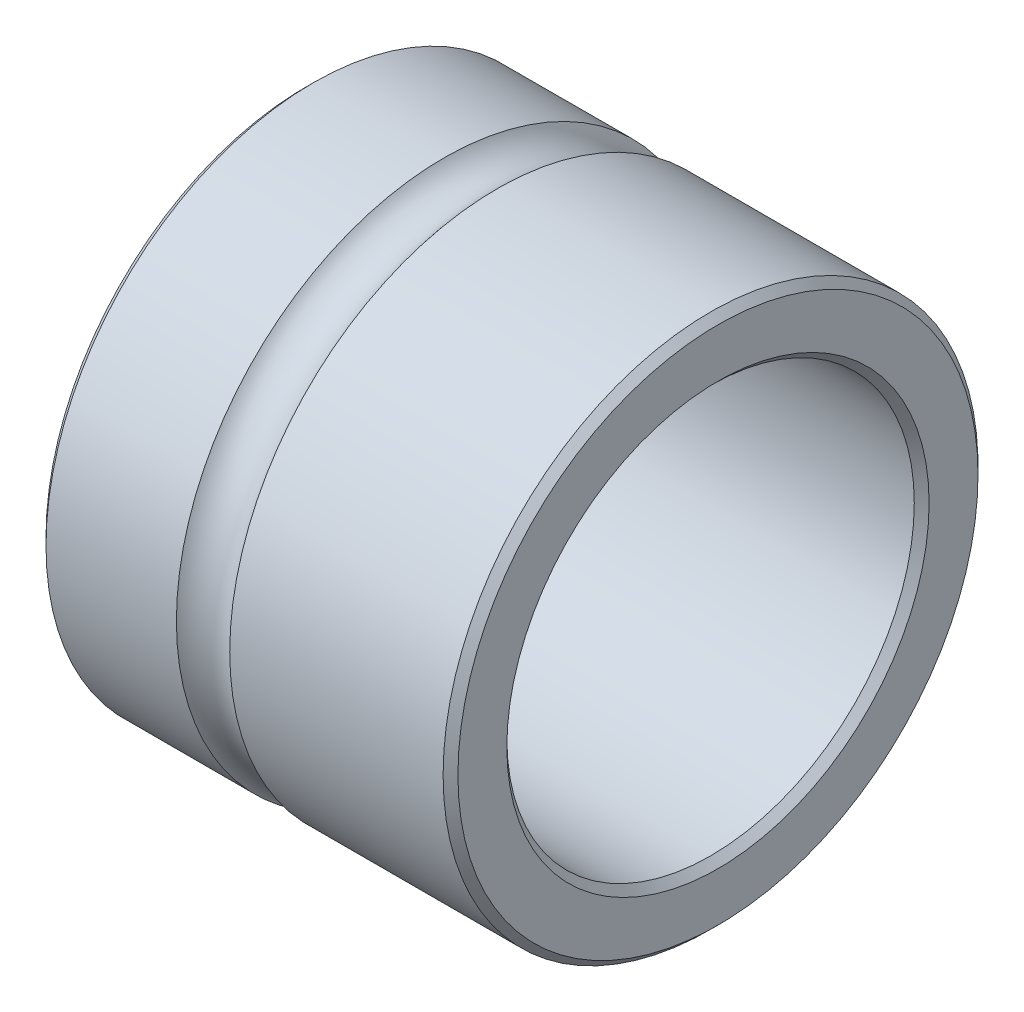
ISO-10303-21;
HEADER;
FILE_DESCRIPTION(('STEP AP214'),'2;1');
FILE_NAME('part.step','',(''),(''),'','','');
FILE_SCHEMA(('AUTOMOTIVE_DESIGN { 1 0 10303 214 1 1 1 1 }'));
ENDSEC;
DATA;
#1=APPLICATION_CONTEXT('core data for automotive mechanical design processes');
#2=APPLICATION_PROTOCOL_DEFINITION('international standard','automotive_design',2000,#1);
#3=PRODUCT_CONTEXT('',#1,'mechanical');
#4=PRODUCT('Part','Part','',(#3));
#5=PRODUCT_RELATED_PRODUCT_CATEGORY('part','',(#4));
#6=PRODUCT_DEFINITION_FORMATION('','',#4);
#7=PRODUCT_DEFINITION_CONTEXT('part definition',#1,'design');
#8=PRODUCT_DEFINITION('design','',#6,#7);
#9=PRODUCT_DEFINITION_SHAPE('','',#8);
#10=(LENGTH_UNIT() NAMED_UNIT(*) SI_UNIT(.MILLI.,.METRE.));
#11=(NAMED_UNIT(*) PLANE_ANGLE_UNIT() SI_UNIT($,.RADIAN.));
#12=(NAMED_UNIT(*) SI_UNIT($,.STERADIAN.) SOLID_ANGLE_UNIT());
#13=UNCERTAINTY_MEASURE_WITH_UNIT(LENGTH_MEASURE(1.E-05),#10,'distance_accuracy_value','');
#14=(GEOMETRIC_REPRESENTATION_CONTEXT(3) GLOBAL_UNCERTAINTY_ASSIGNED_CONTEXT((#13)) GLOBAL_UNIT_ASSIGNED_CONTEXT((#10,
#11,#12)) REPRESENTATION_CONTEXT('',''));
#15=CARTESIAN_POINT('',(0.,0.,0.));
#16=DIRECTION('',(0.,0.,1.));
#17=DIRECTION('',(1.,0.,0.));
#18=AXIS2_PLACEMENT_3D('',#15,#16,#17);
#19=CARTESIAN_POINT('',(-22.2,36.1,0.));
#20=DIRECTION('',(1.,0.,0.));
#21=DIRECTION('',(0.,0.,-1.));
#22=AXIS2_PLACEMENT_3D('',#19,#20,#21);
#23=PLANE('',#22);
#24=CARTESIAN_POINT('',(-22.2,0.,0.));
#25=DIRECTION('',(1.,0.,0.));
#26=DIRECTION('',(0.,0.,-1.));
#27=AXIS2_PLACEMENT_3D('',#24,#25,#26);
#28=CIRCLE('',#27,35.1);
#29=CARTESIAN_POINT('',(-22.2,0.,-35.1));
#30=VERTEX_POINT('',#29);
#31=EDGE_CURVE('E56',#30,#30,#28,.F.);
#32=ORIENTED_EDGE('',*,*,#31,.T.);
#33=EDGE_LOOP('',(#32));
#34=FACE_BOUND('',#33,.T.);
#35=CARTESIAN_POINT('',(-22.2,0.,0.));
#36=DIRECTION('',(1.,0.,0.));
#37=DIRECTION('',(0.,0.,-1.));
#38=AXIS2_PLACEMENT_3D('',#35,#36,#37);
#39=CIRCLE('',#38,28.5);
#40=CARTESIAN_POINT('',(-22.2,0.,-28.5));
#41=VERTEX_POINT('',#40);
#42=EDGE_CURVE('E59',#41,#41,#39,.T.);
#43=ORIENTED_EDGE('',*,*,#42,.T.);
#44=EDGE_LOOP('',(#43));
#45=FACE_BOUND('',#44,.T.);
#46=ADVANCED_FACE('F30',(#34,#45),#23,.F.);
#47=CARTESIAN_POINT('',(-55.0165916800214,0.,0.));
#48=DIRECTION('',(-1.,0.,0.));
#49=DIRECTION('',(0.,0.,1.));
#50=AXIS2_PLACEMENT_3D('',#47,#48,#49);
#51=CYLINDRICAL_SURFACE('',#50,27.5);
#52=CARTESIAN_POINT('',(-21.2,0.,0.));
#53=DIRECTION('',(1.,0.,0.));
#54=DIRECTION('',(0.,0.,-1.));
#55=AXIS2_PLACEMENT_3D('',#52,#53,#54);
#56=CIRCLE('',#55,27.5);
#57=CARTESIAN_POINT('',(-21.2,0.,-27.5));
#58=VERTEX_POINT('',#57);
#59=EDGE_CURVE('E45',#58,#58,#56,.F.);
#60=ORIENTED_EDGE('',*,*,#59,.T.);
#61=EDGE_LOOP('',(#60));
#62=FACE_BOUND('',#61,.T.);
#63=CARTESIAN_POINT('',(32.4,0.,0.));
#64=DIRECTION('',(-1.,0.,0.));
#65=DIRECTION('',(0.,0.,1.));
#66=AXIS2_PLACEMENT_3D('',#63,#64,#65);
#67=CIRCLE('',#66,27.5);
#68=CARTESIAN_POINT('',(32.4,0.,27.5));
#69=VERTEX_POINT('',#68);
#70=EDGE_CURVE('E50',#69,#69,#67,.F.);
#71=ORIENTED_EDGE('',*,*,#70,.T.);
#72=EDGE_LOOP('',(#71));
#73=FACE_BOUND('',#72,.T.);
#74=ADVANCED_FACE('F84',(#62,#73),#51,.F.);
#75=CARTESIAN_POINT('',(33.4,36.1,0.));
#76=DIRECTION('',(-1.,0.,0.));
#77=DIRECTION('',(0.,0.,1.));
#78=AXIS2_PLACEMENT_3D('',#75,#76,#77);
#79=PLANE('',#78);
#80=CARTESIAN_POINT('',(33.4,0.,0.));
#81=DIRECTION('',(-1.,0.,0.));
#82=DIRECTION('',(0.,0.,1.));
#83=AXIS2_PLACEMENT_3D('',#80,#81,#82);
#84=CIRCLE('',#83,28.5);
#85=CARTESIAN_POINT('',(33.4,0.,28.5));
#86=VERTEX_POINT('',#85);
#87=EDGE_CURVE('E37',#86,#86,#84,.T.);
#88=ORIENTED_EDGE('',*,*,#87,.T.);
#89=EDGE_LOOP('',(#88));
#90=FACE_BOUND('',#89,.T.);
#91=CARTESIAN_POINT('',(33.4,0.,0.));
#92=DIRECTION('',(-1.,0.,0.));
#93=DIRECTION('',(0.,0.,1.));
#94=AXIS2_PLACEMENT_3D('',#91,#92,#93);
#95=CIRCLE('',#94,35.1);
#96=CARTESIAN_POINT('',(33.4,0.,35.1));
#97=VERTEX_POINT('',#96);
#98=EDGE_CURVE('E41',#97,#97,#95,.F.);
#99=ORIENTED_EDGE('',*,*,#98,.T.);
#100=EDGE_LOOP('',(#99));
#101=FACE_BOUND('',#100,.T.);
#102=ADVANCED_FACE('F79',(#90,#101),#79,.F.);
#103=CARTESIAN_POINT('',(-55.0165916800214,0.,0.));
#104=DIRECTION('',(-1.,0.,0.));
#105=DIRECTION('',(0.,0.,1.));
#106=AXIS2_PLACEMENT_3D('',#103,#104,#105);
#107=CYLINDRICAL_SURFACE('',#106,36.1);
#108=CARTESIAN_POINT('',(32.4,0.,0.));
#109=DIRECTION('',(-1.,0.,0.));
#110=DIRECTION('',(0.,0.,1.));
#111=AXIS2_PLACEMENT_3D('',#108,#109,#110);
#112=CIRCLE('',#111,36.1);
#113=CARTESIAN_POINT('',(32.4,0.,36.1));
#114=VERTEX_POINT('',#113);
#115=EDGE_CURVE('E10',#114,#114,#112,.T.);
#116=ORIENTED_EDGE('',*,*,#115,.T.);
#117=EDGE_LOOP('',(#116));
#118=FACE_BOUND('',#117,.T.);
#119=CARTESIAN_POINT('',(3.6,0.,0.));
#120=DIRECTION('',(-1.,0.,0.));
#121=DIRECTION('',(0.,0.,1.));
#122=AXIS2_PLACEMENT_3D('',#119,#120,#121);
#123=CIRCLE('',#122,36.1);
#124=CARTESIAN_POINT('',(3.6,0.,36.1));
#125=VERTEX_POINT('',#124);
#126=EDGE_CURVE('E62',#125,#125,#123,.T.);
#127=ORIENTED_EDGE('',*,*,#126,.F.);
#128=EDGE_LOOP('',(#127));
#129=FACE_BOUND('',#128,.T.);
#130=ADVANCED_FACE('F74',(#118,#129),#107,.T.);
#131=CARTESIAN_POINT('',(0.,0.,0.));
#132=DIRECTION('',(-1.,0.,0.));
#133=DIRECTION('',(0.,0.,1.));
#134=AXIS2_PLACEMENT_3D('',#131,#132,#133);
#135=TOROIDAL_SURFACE('',#134,38.8,4.5);
#136=CARTESIAN_POINT('',(-3.6,0.,0.));
#137=DIRECTION('',(-1.,0.,0.));
#138=DIRECTION('',(0.,0.,1.));
#139=AXIS2_PLACEMENT_3D('',#136,#137,#138);
#140=CIRCLE('',#139,36.1);
#141=CARTESIAN_POINT('',(-3.6,0.,36.1));
#142=VERTEX_POINT('',#141);
#143=EDGE_CURVE('E65',#142,#142,#140,.T.);
#144=ORIENTED_EDGE('',*,*,#143,.F.);
#145=EDGE_LOOP('',(#144));
#146=FACE_BOUND('',#145,.T.);
#147=ORIENTED_EDGE('',*,*,#126,.T.);
#148=EDGE_LOOP('',(#147));
#149=FACE_BOUND('',#148,.T.);
#150=ADVANCED_FACE('F71',(#146,#149),#135,.F.);
#151=CARTESIAN_POINT('',(-55.0165916800214,0.,0.));
#152=DIRECTION('',(-1.,0.,0.));
#153=DIRECTION('',(0.,0.,1.));
#154=AXIS2_PLACEMENT_3D('',#151,#152,#153);
#155=CYLINDRICAL_SURFACE('',#154,36.1);
#156=CARTESIAN_POINT('',(-21.2,0.,0.));
#157=DIRECTION('',(1.,0.,0.));
#158=DIRECTION('',(0.,0.,-1.));
#159=AXIS2_PLACEMENT_3D('',#156,#157,#158);
#160=CIRCLE('',#159,36.1);
#161=CARTESIAN_POINT('',(-21.2,0.,-36.1));
#162=VERTEX_POINT('',#161);
#163=EDGE_CURVE('E53',#162,#162,#160,.T.);
#164=ORIENTED_EDGE('',*,*,#163,.T.);
#165=EDGE_LOOP('',(#164));
#166=FACE_BOUND('',#165,.T.);
#167=ORIENTED_EDGE('',*,*,#143,.T.);
#168=EDGE_LOOP('',(#167));
#169=FACE_BOUND('',#168,.T.);
#170=ADVANCED_FACE('F69',(#166,#169),#155,.T.);
#171=CARTESIAN_POINT('',(-22.2,0.,0.));
#172=DIRECTION('',(1.,0.,0.));
#173=DIRECTION('',(0.,0.,-1.));
#174=AXIS2_PLACEMENT_3D('',#171,#172,#173);
#175=CONICAL_SURFACE('',#174,35.1,0.785398163397448);
#176=ORIENTED_EDGE('',*,*,#163,.F.);
#177=EDGE_LOOP('',(#176));
#178=FACE_BOUND('',#177,.T.);
#179=ORIENTED_EDGE('',*,*,#31,.F.);
#180=EDGE_LOOP('',(#179));
#181=FACE_BOUND('',#180,.T.);
#182=ADVANCED_FACE('F96',(#178,#181),#175,.T.);
#183=CARTESIAN_POINT('',(-21.2,0.,0.));
#184=DIRECTION('',(-1.,0.,0.));
#185=DIRECTION('',(0.,0.,1.));
#186=AXIS2_PLACEMENT_3D('',#183,#184,#185);
#187=CONICAL_SURFACE('',#186,27.5,0.785398163397454);
#188=ORIENTED_EDGE('',*,*,#42,.F.);
#189=EDGE_LOOP('',(#188));
#190=FACE_BOUND('',#189,.T.);
#191=ORIENTED_EDGE('',*,*,#59,.F.);
#192=EDGE_LOOP('',(#191));
#193=FACE_BOUND('',#192,.T.);
#194=ADVANCED_FACE('F99',(#190,#193),#187,.F.);
#195=CARTESIAN_POINT('',(33.4,0.,0.));
#196=DIRECTION('',(1.,0.,0.));
#197=DIRECTION('',(0.,0.,-1.));
#198=AXIS2_PLACEMENT_3D('',#195,#196,#197);
#199=CONICAL_SURFACE('',#198,28.5,0.785398163397443);
#200=ORIENTED_EDGE('',*,*,#70,.F.);
#201=EDGE_LOOP('',(#200));
#202=FACE_BOUND('',#201,.T.);
#203=ORIENTED_EDGE('',*,*,#87,.F.);
#204=EDGE_LOOP('',(#203));
#205=FACE_BOUND('',#204,.T.);
#206=ADVANCED_FACE('F102',(#202,#205),#199,.F.);
#207=CARTESIAN_POINT('',(32.4,0.,0.));
#208=DIRECTION('',(-1.,0.,0.));
#209=DIRECTION('',(0.,0.,1.));
#210=AXIS2_PLACEMENT_3D('',#207,#208,#209);
#211=CONICAL_SURFACE('',#210,36.1,0.785398163397448);
#212=ORIENTED_EDGE('',*,*,#98,.F.);
#213=EDGE_LOOP('',(#212));
#214=FACE_BOUND('',#213,.T.);
#215=ORIENTED_EDGE('',*,*,#115,.F.);
#216=EDGE_LOOP('',(#215));
#217=FACE_BOUND('',#216,.T.);
#218=ADVANCED_FACE('F32',(#214,#217),#211,.T.);
#219=CLOSED_SHELL('',(#46,#74,#102,#130,#150,#170,#182,#194,#206,#218));
#220=MANIFOLD_SOLID_BREP('B2',#219);
#221=ADVANCED_BREP_SHAPE_REPRESENTATION('',(#18,#220),#14);
#222=SHAPE_DEFINITION_REPRESENTATION(#9,#221);
ENDSEC;
END-ISO-10303-21;
